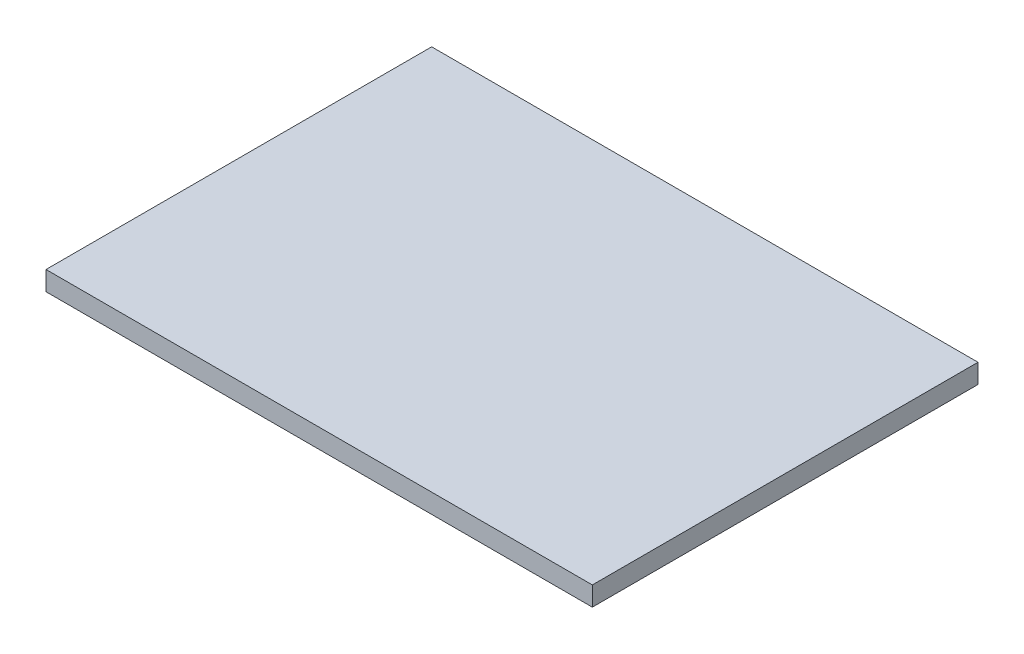
ISO-10303-21;
HEADER;
FILE_DESCRIPTION(('STEP AP214'),'2;1');
FILE_NAME('part.step','',(''),(''),'','','');
FILE_SCHEMA(('AUTOMOTIVE_DESIGN { 1 0 10303 214 1 1 1 1 }'));
ENDSEC;
DATA;
#1=APPLICATION_CONTEXT('core data for automotive mechanical design processes');
#2=APPLICATION_PROTOCOL_DEFINITION('international standard','automotive_design',2000,#1);
#3=PRODUCT_CONTEXT('',#1,'mechanical');
#4=PRODUCT('Part','Part','',(#3));
#5=PRODUCT_RELATED_PRODUCT_CATEGORY('part','',(#4));
#6=PRODUCT_DEFINITION_FORMATION('','',#4);
#7=PRODUCT_DEFINITION_CONTEXT('part definition',#1,'design');
#8=PRODUCT_DEFINITION('design','',#6,#7);
#9=PRODUCT_DEFINITION_SHAPE('','',#8);
#10=(LENGTH_UNIT() NAMED_UNIT(*) SI_UNIT(.MILLI.,.METRE.));
#11=(NAMED_UNIT(*) PLANE_ANGLE_UNIT() SI_UNIT($,.RADIAN.));
#12=(NAMED_UNIT(*) SI_UNIT($,.STERADIAN.) SOLID_ANGLE_UNIT());
#13=UNCERTAINTY_MEASURE_WITH_UNIT(LENGTH_MEASURE(1.E-05),#10,'distance_accuracy_value','');
#14=(GEOMETRIC_REPRESENTATION_CONTEXT(3) GLOBAL_UNCERTAINTY_ASSIGNED_CONTEXT((#13)) GLOBAL_UNIT_ASSIGNED_CONTEXT((#10,
#11,#12)) REPRESENTATION_CONTEXT('',''));
#15=CARTESIAN_POINT('',(0.,0.,0.));
#16=DIRECTION('',(0.,0.,1.));
#17=DIRECTION('',(1.,0.,0.));
#18=AXIS2_PLACEMENT_3D('',#15,#16,#17);
#19=CARTESIAN_POINT('',(0.,6.,0.));
#20=DIRECTION('',(1.,0.,0.));
#21=DIRECTION('',(0.,0.,-1.));
#22=AXIS2_PLACEMENT_3D('',#19,#20,#21);
#23=PLANE('',#22);
#24=DIRECTION('',(0.,0.,1.));
#25=VECTOR('',#24,1.);
#26=CARTESIAN_POINT('',(0.,0.,0.));
#27=LINE('',#26,#25);
#28=CARTESIAN_POINT('',(0.,0.,-120.));
#29=VERTEX_POINT('',#28);
#30=CARTESIAN_POINT('',(0.,0.,0.));
#31=VERTEX_POINT('',#30);
#32=EDGE_CURVE('E110',#29,#31,#27,.T.);
#33=ORIENTED_EDGE('',*,*,#32,.T.);
#34=DIRECTION('',(0.,-1.,0.));
#35=VECTOR('',#34,1.);
#36=CARTESIAN_POINT('',(0.,6.,0.));
#37=LINE('',#36,#35);
#38=CARTESIAN_POINT('',(0.,6.,0.));
#39=VERTEX_POINT('',#38);
#40=EDGE_CURVE('E11',#39,#31,#37,.T.);
#41=ORIENTED_EDGE('',*,*,#40,.F.);
#42=DIRECTION('',(0.,0.,1.));
#43=VECTOR('',#42,1.);
#44=CARTESIAN_POINT('',(0.,6.,0.));
#45=LINE('',#44,#43);
#46=CARTESIAN_POINT('',(0.,6.,-120.));
#47=VERTEX_POINT('',#46);
#48=EDGE_CURVE('E98',#47,#39,#45,.T.);
#49=ORIENTED_EDGE('',*,*,#48,.F.);
#50=DIRECTION('',(0.,-1.,0.));
#51=VECTOR('',#50,1.);
#52=CARTESIAN_POINT('',(0.,6.,-120.));
#53=LINE('',#52,#51);
#54=EDGE_CURVE('E106',#47,#29,#53,.T.);
#55=ORIENTED_EDGE('',*,*,#54,.T.);
#56=EDGE_LOOP('',(#33,#41,#49,#55));
#57=FACE_BOUND('',#56,.T.);
#58=ADVANCED_FACE('F47',(#57),#23,.F.);
#59=CARTESIAN_POINT('',(0.,6.,0.));
#60=DIRECTION('',(0.,0.,-1.));
#61=DIRECTION('',(-1.,0.,0.));
#62=AXIS2_PLACEMENT_3D('',#59,#60,#61);
#63=PLANE('',#62);
#64=DIRECTION('',(1.,0.,0.));
#65=VECTOR('',#64,1.);
#66=CARTESIAN_POINT('',(0.,0.,0.));
#67=LINE('',#66,#65);
#68=CARTESIAN_POINT('',(170.,0.,0.));
#69=VERTEX_POINT('',#68);
#70=EDGE_CURVE('E102',#31,#69,#67,.T.);
#71=ORIENTED_EDGE('',*,*,#70,.T.);
#72=DIRECTION('',(0.,-1.,0.));
#73=VECTOR('',#72,1.);
#74=CARTESIAN_POINT('',(170.,6.,0.));
#75=LINE('',#74,#73);
#76=CARTESIAN_POINT('',(170.,6.,0.));
#77=VERTEX_POINT('',#76);
#78=EDGE_CURVE('E55',#77,#69,#75,.T.);
#79=ORIENTED_EDGE('',*,*,#78,.F.);
#80=DIRECTION('',(1.,0.,0.));
#81=VECTOR('',#80,1.);
#82=CARTESIAN_POINT('',(0.,6.,0.));
#83=LINE('',#82,#81);
#84=EDGE_CURVE('E93',#39,#77,#83,.T.);
#85=ORIENTED_EDGE('',*,*,#84,.F.);
#86=ORIENTED_EDGE('',*,*,#40,.T.);
#87=EDGE_LOOP('',(#71,#79,#85,#86));
#88=FACE_BOUND('',#87,.T.);
#89=ADVANCED_FACE('F101',(#88),#63,.F.);
#90=CARTESIAN_POINT('',(170.,6.,0.));
#91=DIRECTION('',(-1.,0.,0.));
#92=DIRECTION('',(0.,0.,1.));
#93=AXIS2_PLACEMENT_3D('',#90,#91,#92);
#94=PLANE('',#93);
#95=DIRECTION('',(0.,0.,-1.));
#96=VECTOR('',#95,1.);
#97=CARTESIAN_POINT('',(170.,0.,0.));
#98=LINE('',#97,#96);
#99=CARTESIAN_POINT('',(170.,0.,-120.));
#100=VERTEX_POINT('',#99);
#101=EDGE_CURVE('E80',#69,#100,#98,.T.);
#102=ORIENTED_EDGE('',*,*,#101,.T.);
#103=DIRECTION('',(0.,-1.,0.));
#104=VECTOR('',#103,1.);
#105=CARTESIAN_POINT('',(170.,6.,-120.));
#106=LINE('',#105,#104);
#107=CARTESIAN_POINT('',(170.,6.,-120.));
#108=VERTEX_POINT('',#107);
#109=EDGE_CURVE('E103',#108,#100,#106,.T.);
#110=ORIENTED_EDGE('',*,*,#109,.F.);
#111=DIRECTION('',(0.,0.,-1.));
#112=VECTOR('',#111,1.);
#113=CARTESIAN_POINT('',(170.,6.,0.));
#114=LINE('',#113,#112);
#115=EDGE_CURVE('E96',#77,#108,#114,.T.);
#116=ORIENTED_EDGE('',*,*,#115,.F.);
#117=ORIENTED_EDGE('',*,*,#78,.T.);
#118=EDGE_LOOP('',(#102,#110,#116,#117));
#119=FACE_BOUND('',#118,.T.);
#120=ADVANCED_FACE('F104',(#119),#94,.F.);
#121=CARTESIAN_POINT('',(0.,6.,-120.));
#122=DIRECTION('',(0.,0.,1.));
#123=DIRECTION('',(1.,0.,0.));
#124=AXIS2_PLACEMENT_3D('',#121,#122,#123);
#125=PLANE('',#124);
#126=DIRECTION('',(-1.,0.,0.));
#127=VECTOR('',#126,1.);
#128=CARTESIAN_POINT('',(0.,0.,-120.));
#129=LINE('',#128,#127);
#130=EDGE_CURVE('E86',#100,#29,#129,.T.);
#131=ORIENTED_EDGE('',*,*,#130,.T.);
#132=ORIENTED_EDGE('',*,*,#54,.F.);
#133=DIRECTION('',(-1.,0.,0.));
#134=VECTOR('',#133,1.);
#135=CARTESIAN_POINT('',(0.,6.,-120.));
#136=LINE('',#135,#134);
#137=EDGE_CURVE('E63',#108,#47,#136,.T.);
#138=ORIENTED_EDGE('',*,*,#137,.F.);
#139=ORIENTED_EDGE('',*,*,#109,.T.);
#140=EDGE_LOOP('',(#131,#132,#138,#139));
#141=FACE_BOUND('',#140,.T.);
#142=ADVANCED_FACE('F117',(#141),#125,.F.);
#143=CARTESIAN_POINT('',(0.,6.,0.));
#144=DIRECTION('',(0.,-1.,0.));
#145=DIRECTION('',(0.,0.,-1.));
#146=AXIS2_PLACEMENT_3D('',#143,#144,#145);
#147=PLANE('',#146);
#148=ORIENTED_EDGE('',*,*,#48,.T.);
#149=ORIENTED_EDGE('',*,*,#84,.T.);
#150=ORIENTED_EDGE('',*,*,#115,.T.);
#151=ORIENTED_EDGE('',*,*,#137,.T.);
#152=EDGE_LOOP('',(#148,#149,#150,#151));
#153=FACE_BOUND('',#152,.T.);
#154=ADVANCED_FACE('F94',(#153),#147,.F.);
#155=CARTESIAN_POINT('',(0.,0.,0.));
#156=DIRECTION('',(0.,-1.,0.));
#157=DIRECTION('',(0.,0.,-1.));
#158=AXIS2_PLACEMENT_3D('',#155,#156,#157);
#159=PLANE('',#158);
#160=ORIENTED_EDGE('',*,*,#32,.F.);
#161=ORIENTED_EDGE('',*,*,#130,.F.);
#162=ORIENTED_EDGE('',*,*,#101,.F.);
#163=ORIENTED_EDGE('',*,*,#70,.F.);
#164=EDGE_LOOP('',(#160,#161,#162,#163));
#165=FACE_BOUND('',#164,.T.);
#166=ADVANCED_FACE('F120',(#165),#159,.T.);
#167=CLOSED_SHELL('',(#58,#89,#120,#142,#154,#166));
#168=MANIFOLD_SOLID_BREP('B2',#167);
#169=ADVANCED_BREP_SHAPE_REPRESENTATION('',(#18,#168),#14);
#170=SHAPE_DEFINITION_REPRESENTATION(#9,#169);
ENDSEC;
END-ISO-10303-21;
